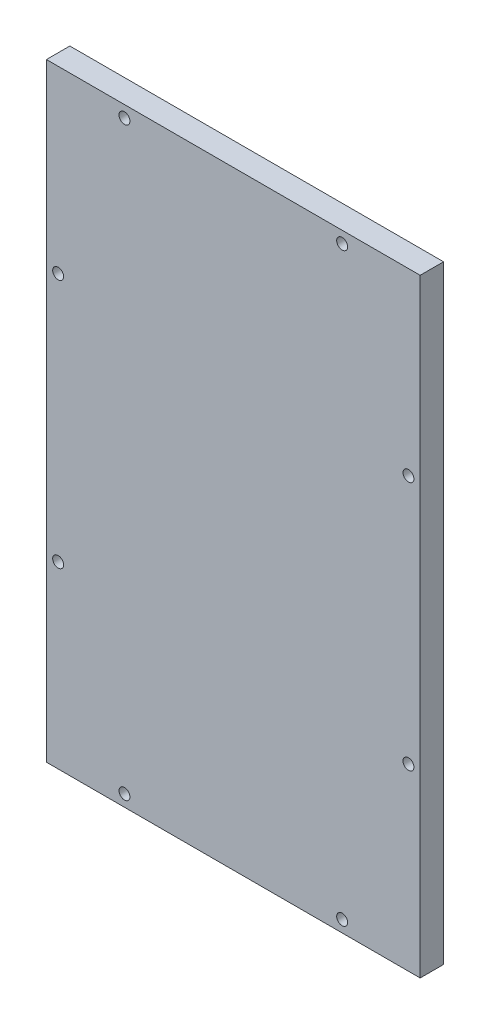
ISO-10303-21;
HEADER;
FILE_DESCRIPTION(('STEP AP214'),'2;1');
FILE_NAME('part.step','',(''),(''),'','','');
FILE_SCHEMA(('AUTOMOTIVE_DESIGN { 1 0 10303 214 1 1 1 1 }'));
ENDSEC;
DATA;
#1=APPLICATION_CONTEXT('core data for automotive mechanical design processes');
#2=APPLICATION_PROTOCOL_DEFINITION('international standard','automotive_design',2000,#1);
#3=PRODUCT_CONTEXT('',#1,'mechanical');
#4=PRODUCT('Part','Part','',(#3));
#5=PRODUCT_RELATED_PRODUCT_CATEGORY('part','',(#4));
#6=PRODUCT_DEFINITION_FORMATION('','',#4);
#7=PRODUCT_DEFINITION_CONTEXT('part definition',#1,'design');
#8=PRODUCT_DEFINITION('design','',#6,#7);
#9=PRODUCT_DEFINITION_SHAPE('','',#8);
#10=(LENGTH_UNIT() NAMED_UNIT(*) SI_UNIT(.MILLI.,.METRE.));
#11=(NAMED_UNIT(*) PLANE_ANGLE_UNIT() SI_UNIT($,.RADIAN.));
#12=(NAMED_UNIT(*) SI_UNIT($,.STERADIAN.) SOLID_ANGLE_UNIT());
#13=UNCERTAINTY_MEASURE_WITH_UNIT(LENGTH_MEASURE(1.E-05),#10,'distance_accuracy_value','');
#14=(GEOMETRIC_REPRESENTATION_CONTEXT(3) GLOBAL_UNCERTAINTY_ASSIGNED_CONTEXT((#13)) GLOBAL_UNIT_ASSIGNED_CONTEXT((#10,
#11,#12)) REPRESENTATION_CONTEXT('',''));
#15=CARTESIAN_POINT('',(0.,0.,0.));
#16=DIRECTION('',(0.,0.,1.));
#17=DIRECTION('',(1.,0.,0.));
#18=AXIS2_PLACEMENT_3D('',#15,#16,#17);
#19=CARTESIAN_POINT('',(22.45,-16.,3.));
#20=DIRECTION('',(0.,0.,-1.));
#21=DIRECTION('',(-1.,0.,0.));
#22=AXIS2_PLACEMENT_3D('',#19,#20,#21);
#23=CYLINDRICAL_SURFACE('',#22,0.699999999999998);
#24=CARTESIAN_POINT('',(22.45,-16.,3.));
#25=DIRECTION('',(0.,0.,-1.));
#26=DIRECTION('',(-1.,0.,0.));
#27=AXIS2_PLACEMENT_3D('',#24,#25,#26);
#28=CIRCLE('',#27,0.699999999999998);
#29=CARTESIAN_POINT('',(21.75,-16.,3.));
#30=VERTEX_POINT('',#29);
#31=EDGE_CURVE('E109',#30,#30,#28,.T.);
#32=ORIENTED_EDGE('',*,*,#31,.F.);
#33=EDGE_LOOP('',(#32));
#34=FACE_BOUND('',#33,.T.);
#35=CARTESIAN_POINT('',(22.45,-16.,1.5));
#36=DIRECTION('',(0.,0.,-1.));
#37=DIRECTION('',(-1.,0.,0.));
#38=AXIS2_PLACEMENT_3D('',#35,#36,#37);
#39=CIRCLE('',#38,0.699999999999998);
#40=CARTESIAN_POINT('',(21.75,-16.,1.5));
#41=VERTEX_POINT('',#40);
#42=EDGE_CURVE('E43',#41,#41,#39,.F.);
#43=ORIENTED_EDGE('',*,*,#42,.F.);
#44=EDGE_LOOP('',(#43));
#45=FACE_BOUND('',#44,.T.);
#46=ADVANCED_FACE('F39',(#34,#45),#23,.F.);
#47=CARTESIAN_POINT('',(-13.95,-37.5,3.));
#48=DIRECTION('',(0.,0.,-1.));
#49=DIRECTION('',(-1.,0.,0.));
#50=AXIS2_PLACEMENT_3D('',#47,#48,#49);
#51=CYLINDRICAL_SURFACE('',#50,0.699999999999999);
#52=CARTESIAN_POINT('',(-13.95,-37.5,3.));
#53=DIRECTION('',(0.,0.,-1.));
#54=DIRECTION('',(-1.,0.,0.));
#55=AXIS2_PLACEMENT_3D('',#52,#53,#54);
#56=CIRCLE('',#55,0.699999999999999);
#57=CARTESIAN_POINT('',(-14.65,-37.5,3.));
#58=VERTEX_POINT('',#57);
#59=EDGE_CURVE('E147',#58,#58,#56,.T.);
#60=ORIENTED_EDGE('',*,*,#59,.F.);
#61=EDGE_LOOP('',(#60));
#62=FACE_BOUND('',#61,.T.);
#63=CARTESIAN_POINT('',(-13.95,-37.5,1.5));
#64=DIRECTION('',(0.,0.,-1.));
#65=DIRECTION('',(-1.,0.,0.));
#66=AXIS2_PLACEMENT_3D('',#63,#64,#65);
#67=CIRCLE('',#66,0.699999999999999);
#68=CARTESIAN_POINT('',(-14.65,-37.5,1.5));
#69=VERTEX_POINT('',#68);
#70=EDGE_CURVE('E133',#69,#69,#67,.F.);
#71=ORIENTED_EDGE('',*,*,#70,.F.);
#72=EDGE_LOOP('',(#71));
#73=FACE_BOUND('',#72,.T.);
#74=ADVANCED_FACE('F173',(#62,#73),#51,.F.);
#75=CARTESIAN_POINT('',(-22.45,16.,3.));
#76=DIRECTION('',(0.,0.,-1.));
#77=DIRECTION('',(-1.,0.,0.));
#78=AXIS2_PLACEMENT_3D('',#75,#76,#77);
#79=CYLINDRICAL_SURFACE('',#78,0.699999999999998);
#80=CARTESIAN_POINT('',(-22.45,16.,3.));
#81=DIRECTION('',(0.,0.,-1.));
#82=DIRECTION('',(-1.,0.,0.));
#83=AXIS2_PLACEMENT_3D('',#80,#81,#82);
#84=CIRCLE('',#83,0.699999999999998);
#85=CARTESIAN_POINT('',(-23.15,16.,3.));
#86=VERTEX_POINT('',#85);
#87=EDGE_CURVE('E142',#86,#86,#84,.T.);
#88=ORIENTED_EDGE('',*,*,#87,.F.);
#89=EDGE_LOOP('',(#88));
#90=FACE_BOUND('',#89,.T.);
#91=CARTESIAN_POINT('',(-22.45,16.,1.5));
#92=DIRECTION('',(0.,0.,-1.));
#93=DIRECTION('',(-1.,0.,0.));
#94=AXIS2_PLACEMENT_3D('',#91,#92,#93);
#95=CIRCLE('',#94,0.699999999999998);
#96=CARTESIAN_POINT('',(-23.15,16.,1.5));
#97=VERTEX_POINT('',#96);
#98=EDGE_CURVE('E131',#97,#97,#95,.F.);
#99=ORIENTED_EDGE('',*,*,#98,.F.);
#100=EDGE_LOOP('',(#99));
#101=FACE_BOUND('',#100,.T.);
#102=ADVANCED_FACE('F178',(#90,#101),#79,.F.);
#103=CARTESIAN_POINT('',(-22.45,-16.,3.));
#104=DIRECTION('',(0.,0.,-1.));
#105=DIRECTION('',(-1.,0.,0.));
#106=AXIS2_PLACEMENT_3D('',#103,#104,#105);
#107=CYLINDRICAL_SURFACE('',#106,0.699999999999998);
#108=CARTESIAN_POINT('',(-22.45,-16.,3.));
#109=DIRECTION('',(0.,0.,-1.));
#110=DIRECTION('',(-1.,0.,0.));
#111=AXIS2_PLACEMENT_3D('',#108,#109,#110);
#112=CIRCLE('',#111,0.699999999999998);
#113=CARTESIAN_POINT('',(-23.15,-16.,3.));
#114=VERTEX_POINT('',#113);
#115=EDGE_CURVE('E138',#114,#114,#112,.T.);
#116=ORIENTED_EDGE('',*,*,#115,.F.);
#117=EDGE_LOOP('',(#116));
#118=FACE_BOUND('',#117,.T.);
#119=CARTESIAN_POINT('',(-22.45,-16.,1.5));
#120=DIRECTION('',(0.,0.,-1.));
#121=DIRECTION('',(-1.,0.,0.));
#122=AXIS2_PLACEMENT_3D('',#119,#120,#121);
#123=CIRCLE('',#122,0.699999999999998);
#124=CARTESIAN_POINT('',(-23.15,-16.,1.5));
#125=VERTEX_POINT('',#124);
#126=EDGE_CURVE('E128',#125,#125,#123,.F.);
#127=ORIENTED_EDGE('',*,*,#126,.F.);
#128=EDGE_LOOP('',(#127));
#129=FACE_BOUND('',#128,.T.);
#130=ADVANCED_FACE('F221',(#118,#129),#107,.F.);
#131=CARTESIAN_POINT('',(22.45,16.,3.));
#132=DIRECTION('',(0.,0.,-1.));
#133=DIRECTION('',(-1.,0.,0.));
#134=AXIS2_PLACEMENT_3D('',#131,#132,#133);
#135=CYLINDRICAL_SURFACE('',#134,0.699999999999998);
#136=CARTESIAN_POINT('',(22.45,16.,3.));
#137=DIRECTION('',(0.,0.,-1.));
#138=DIRECTION('',(-1.,0.,0.));
#139=AXIS2_PLACEMENT_3D('',#136,#137,#138);
#140=CIRCLE('',#139,0.699999999999998);
#141=CARTESIAN_POINT('',(21.75,16.,3.));
#142=VERTEX_POINT('',#141);
#143=EDGE_CURVE('E162',#142,#142,#140,.T.);
#144=ORIENTED_EDGE('',*,*,#143,.F.);
#145=EDGE_LOOP('',(#144));
#146=FACE_BOUND('',#145,.T.);
#147=CARTESIAN_POINT('',(22.45,16.,1.5));
#148=DIRECTION('',(0.,0.,-1.));
#149=DIRECTION('',(-1.,0.,0.));
#150=AXIS2_PLACEMENT_3D('',#147,#148,#149);
#151=CIRCLE('',#150,0.699999999999998);
#152=CARTESIAN_POINT('',(21.75,16.,1.5));
#153=VERTEX_POINT('',#152);
#154=EDGE_CURVE('E125',#153,#153,#151,.F.);
#155=ORIENTED_EDGE('',*,*,#154,.F.);
#156=EDGE_LOOP('',(#155));
#157=FACE_BOUND('',#156,.T.);
#158=ADVANCED_FACE('F219',(#146,#157),#135,.F.);
#159=CARTESIAN_POINT('',(13.95,37.5,3.));
#160=DIRECTION('',(0.,0.,-1.));
#161=DIRECTION('',(-1.,0.,0.));
#162=AXIS2_PLACEMENT_3D('',#159,#160,#161);
#163=CYLINDRICAL_SURFACE('',#162,0.699999999999999);
#164=CARTESIAN_POINT('',(13.95,37.5,3.));
#165=DIRECTION('',(0.,0.,-1.));
#166=DIRECTION('',(-1.,0.,0.));
#167=AXIS2_PLACEMENT_3D('',#164,#165,#166);
#168=CIRCLE('',#167,0.699999999999999);
#169=CARTESIAN_POINT('',(13.25,37.5,3.));
#170=VERTEX_POINT('',#169);
#171=EDGE_CURVE('E159',#170,#170,#168,.T.);
#172=ORIENTED_EDGE('',*,*,#171,.F.);
#173=EDGE_LOOP('',(#172));
#174=FACE_BOUND('',#173,.T.);
#175=CARTESIAN_POINT('',(13.95,37.5,1.5));
#176=DIRECTION('',(0.,0.,-1.));
#177=DIRECTION('',(-1.,0.,0.));
#178=AXIS2_PLACEMENT_3D('',#175,#176,#177);
#179=CIRCLE('',#178,0.699999999999999);
#180=CARTESIAN_POINT('',(13.25,37.5,1.5));
#181=VERTEX_POINT('',#180);
#182=EDGE_CURVE('E122',#181,#181,#179,.F.);
#183=ORIENTED_EDGE('',*,*,#182,.F.);
#184=EDGE_LOOP('',(#183));
#185=FACE_BOUND('',#184,.T.);
#186=ADVANCED_FACE('F183',(#174,#185),#163,.F.);
#187=CARTESIAN_POINT('',(-13.95,37.5,3.));
#188=DIRECTION('',(0.,0.,-1.));
#189=DIRECTION('',(-1.,0.,0.));
#190=AXIS2_PLACEMENT_3D('',#187,#188,#189);
#191=CYLINDRICAL_SURFACE('',#190,0.699999999999999);
#192=CARTESIAN_POINT('',(-13.95,37.5,3.));
#193=DIRECTION('',(0.,0.,-1.));
#194=DIRECTION('',(-1.,0.,0.));
#195=AXIS2_PLACEMENT_3D('',#192,#193,#194);
#196=CIRCLE('',#195,0.699999999999999);
#197=CARTESIAN_POINT('',(-14.65,37.5,3.));
#198=VERTEX_POINT('',#197);
#199=EDGE_CURVE('E156',#198,#198,#196,.T.);
#200=ORIENTED_EDGE('',*,*,#199,.F.);
#201=EDGE_LOOP('',(#200));
#202=FACE_BOUND('',#201,.T.);
#203=CARTESIAN_POINT('',(-13.95,37.5,1.5));
#204=DIRECTION('',(0.,0.,-1.));
#205=DIRECTION('',(-1.,0.,0.));
#206=AXIS2_PLACEMENT_3D('',#203,#204,#205);
#207=CIRCLE('',#206,0.699999999999999);
#208=CARTESIAN_POINT('',(-14.65,37.5,1.5));
#209=VERTEX_POINT('',#208);
#210=EDGE_CURVE('E118',#209,#209,#207,.F.);
#211=ORIENTED_EDGE('',*,*,#210,.F.);
#212=EDGE_LOOP('',(#211));
#213=FACE_BOUND('',#212,.T.);
#214=ADVANCED_FACE('F206',(#202,#213),#191,.F.);
#215=CARTESIAN_POINT('',(13.95,-37.5,3.));
#216=DIRECTION('',(0.,0.,-1.));
#217=DIRECTION('',(-1.,0.,0.));
#218=AXIS2_PLACEMENT_3D('',#215,#216,#217);
#219=CYLINDRICAL_SURFACE('',#218,0.699999999999999);
#220=CARTESIAN_POINT('',(13.95,-37.5,3.));
#221=DIRECTION('',(0.,0.,-1.));
#222=DIRECTION('',(-1.,0.,0.));
#223=AXIS2_PLACEMENT_3D('',#220,#221,#222);
#224=CIRCLE('',#223,0.699999999999999);
#225=CARTESIAN_POINT('',(13.25,-37.5,3.));
#226=VERTEX_POINT('',#225);
#227=EDGE_CURVE('E154',#226,#226,#224,.T.);
#228=ORIENTED_EDGE('',*,*,#227,.F.);
#229=EDGE_LOOP('',(#228));
#230=FACE_BOUND('',#229,.T.);
#231=CARTESIAN_POINT('',(13.95,-37.5,1.5));
#232=DIRECTION('',(0.,0.,-1.));
#233=DIRECTION('',(-1.,0.,0.));
#234=AXIS2_PLACEMENT_3D('',#231,#232,#233);
#235=CIRCLE('',#234,0.699999999999999);
#236=CARTESIAN_POINT('',(13.25,-37.5,1.5));
#237=VERTEX_POINT('',#236);
#238=EDGE_CURVE('E115',#237,#237,#235,.F.);
#239=ORIENTED_EDGE('',*,*,#238,.F.);
#240=EDGE_LOOP('',(#239));
#241=FACE_BOUND('',#240,.T.);
#242=ADVANCED_FACE('F201',(#230,#241),#219,.F.);
#243=CARTESIAN_POINT('',(-23.95,39.,3.));
#244=DIRECTION('',(1.,0.,0.));
#245=DIRECTION('',(0.,0.,-1.));
#246=AXIS2_PLACEMENT_3D('',#243,#244,#245);
#247=PLANE('',#246);
#248=DIRECTION('',(0.,-1.,0.));
#249=VECTOR('',#248,1.);
#250=CARTESIAN_POINT('',(-23.95,39.,0.));
#251=LINE('',#250,#249);
#252=CARTESIAN_POINT('',(-23.95,39.,0.));
#253=VERTEX_POINT('',#252);
#254=CARTESIAN_POINT('',(-23.95,-39.,0.));
#255=VERTEX_POINT('',#254);
#256=EDGE_CURVE('E106',#253,#255,#251,.T.);
#257=ORIENTED_EDGE('',*,*,#256,.T.);
#258=DIRECTION('',(0.,0.,-1.));
#259=VECTOR('',#258,1.);
#260=CARTESIAN_POINT('',(-23.95,-39.,3.));
#261=LINE('',#260,#259);
#262=CARTESIAN_POINT('',(-23.95,-39.,3.));
#263=VERTEX_POINT('',#262);
#264=EDGE_CURVE('E11',#263,#255,#261,.T.);
#265=ORIENTED_EDGE('',*,*,#264,.F.);
#266=DIRECTION('',(0.,-1.,0.));
#267=VECTOR('',#266,1.);
#268=CARTESIAN_POINT('',(-23.95,39.,3.));
#269=LINE('',#268,#267);
#270=CARTESIAN_POINT('',(-23.95,39.,3.));
#271=VERTEX_POINT('',#270);
#272=EDGE_CURVE('E93',#271,#263,#269,.T.);
#273=ORIENTED_EDGE('',*,*,#272,.F.);
#274=DIRECTION('',(0.,0.,-1.));
#275=VECTOR('',#274,1.);
#276=CARTESIAN_POINT('',(-23.95,39.,3.));
#277=LINE('',#276,#275);
#278=EDGE_CURVE('E102',#271,#253,#277,.T.);
#279=ORIENTED_EDGE('',*,*,#278,.T.);
#280=EDGE_LOOP('',(#257,#265,#273,#279));
#281=FACE_BOUND('',#280,.T.);
#282=ADVANCED_FACE('F41',(#281),#247,.F.);
#283=CARTESIAN_POINT('',(-23.95,-39.,3.));
#284=DIRECTION('',(0.,1.,0.));
#285=DIRECTION('',(0.,0.,1.));
#286=AXIS2_PLACEMENT_3D('',#283,#284,#285);
#287=PLANE('',#286);
#288=DIRECTION('',(1.,0.,0.));
#289=VECTOR('',#288,1.);
#290=CARTESIAN_POINT('',(-23.95,-39.,0.));
#291=LINE('',#290,#289);
#292=CARTESIAN_POINT('',(23.95,-39.,0.));
#293=VERTEX_POINT('',#292);
#294=EDGE_CURVE('E97',#255,#293,#291,.T.);
#295=ORIENTED_EDGE('',*,*,#294,.T.);
#296=DIRECTION('',(0.,0.,-1.));
#297=VECTOR('',#296,1.);
#298=CARTESIAN_POINT('',(23.95,-39.,3.));
#299=LINE('',#298,#297);
#300=CARTESIAN_POINT('',(23.95,-39.,3.));
#301=VERTEX_POINT('',#300);
#302=EDGE_CURVE('E49',#301,#293,#299,.T.);
#303=ORIENTED_EDGE('',*,*,#302,.F.);
#304=DIRECTION('',(1.,0.,0.));
#305=VECTOR('',#304,1.);
#306=CARTESIAN_POINT('',(-23.95,-39.,3.));
#307=LINE('',#306,#305);
#308=EDGE_CURVE('E88',#263,#301,#307,.T.);
#309=ORIENTED_EDGE('',*,*,#308,.F.);
#310=ORIENTED_EDGE('',*,*,#264,.T.);
#311=EDGE_LOOP('',(#295,#303,#309,#310));
#312=FACE_BOUND('',#311,.T.);
#313=ADVANCED_FACE('F96',(#312),#287,.F.);
#314=CARTESIAN_POINT('',(23.95,39.,3.));
#315=DIRECTION('',(-1.,0.,0.));
#316=DIRECTION('',(0.,0.,1.));
#317=AXIS2_PLACEMENT_3D('',#314,#315,#316);
#318=PLANE('',#317);
#319=DIRECTION('',(0.,1.,0.));
#320=VECTOR('',#319,1.);
#321=CARTESIAN_POINT('',(23.95,39.,0.));
#322=LINE('',#321,#320);
#323=CARTESIAN_POINT('',(23.95,39.,0.));
#324=VERTEX_POINT('',#323);
#325=EDGE_CURVE('E75',#293,#324,#322,.T.);
#326=ORIENTED_EDGE('',*,*,#325,.T.);
#327=DIRECTION('',(0.,0.,-1.));
#328=VECTOR('',#327,1.);
#329=CARTESIAN_POINT('',(23.95,39.,3.));
#330=LINE('',#329,#328);
#331=CARTESIAN_POINT('',(23.95,39.,3.));
#332=VERTEX_POINT('',#331);
#333=EDGE_CURVE('E98',#332,#324,#330,.T.);
#334=ORIENTED_EDGE('',*,*,#333,.F.);
#335=DIRECTION('',(0.,1.,0.));
#336=VECTOR('',#335,1.);
#337=CARTESIAN_POINT('',(23.95,39.,3.));
#338=LINE('',#337,#336);
#339=EDGE_CURVE('E91',#301,#332,#338,.T.);
#340=ORIENTED_EDGE('',*,*,#339,.F.);
#341=ORIENTED_EDGE('',*,*,#302,.T.);
#342=EDGE_LOOP('',(#326,#334,#340,#341));
#343=FACE_BOUND('',#342,.T.);
#344=ADVANCED_FACE('F100',(#343),#318,.F.);
#345=CARTESIAN_POINT('',(-23.95,39.,3.));
#346=DIRECTION('',(0.,-1.,0.));
#347=DIRECTION('',(0.,0.,-1.));
#348=AXIS2_PLACEMENT_3D('',#345,#346,#347);
#349=PLANE('',#348);
#350=DIRECTION('',(-1.,0.,0.));
#351=VECTOR('',#350,1.);
#352=CARTESIAN_POINT('',(-23.95,39.,0.));
#353=LINE('',#352,#351);
#354=EDGE_CURVE('E81',#324,#253,#353,.T.);
#355=ORIENTED_EDGE('',*,*,#354,.T.);
#356=ORIENTED_EDGE('',*,*,#278,.F.);
#357=DIRECTION('',(-1.,0.,0.));
#358=VECTOR('',#357,1.);
#359=CARTESIAN_POINT('',(-23.95,39.,3.));
#360=LINE('',#359,#358);
#361=EDGE_CURVE('E58',#332,#271,#360,.T.);
#362=ORIENTED_EDGE('',*,*,#361,.F.);
#363=ORIENTED_EDGE('',*,*,#333,.T.);
#364=EDGE_LOOP('',(#355,#356,#362,#363));
#365=FACE_BOUND('',#364,.T.);
#366=ADVANCED_FACE('F188',(#365),#349,.F.);
#367=CARTESIAN_POINT('',(0.,0.,3.));
#368=DIRECTION('',(0.,0.,1.));
#369=DIRECTION('',(1.,0.,0.));
#370=AXIS2_PLACEMENT_3D('',#367,#368,#369);
#371=PLANE('',#370);
#372=ORIENTED_EDGE('',*,*,#227,.T.);
#373=EDGE_LOOP('',(#372));
#374=FACE_BOUND('',#373,.T.);
#375=ORIENTED_EDGE('',*,*,#199,.T.);
#376=EDGE_LOOP('',(#375));
#377=FACE_BOUND('',#376,.T.);
#378=ORIENTED_EDGE('',*,*,#171,.T.);
#379=EDGE_LOOP('',(#378));
#380=FACE_BOUND('',#379,.T.);
#381=ORIENTED_EDGE('',*,*,#143,.T.);
#382=EDGE_LOOP('',(#381));
#383=FACE_BOUND('',#382,.T.);
#384=ORIENTED_EDGE('',*,*,#115,.T.);
#385=EDGE_LOOP('',(#384));
#386=FACE_BOUND('',#385,.T.);
#387=ORIENTED_EDGE('',*,*,#87,.T.);
#388=EDGE_LOOP('',(#387));
#389=FACE_BOUND('',#388,.T.);
#390=ORIENTED_EDGE('',*,*,#59,.T.);
#391=EDGE_LOOP('',(#390));
#392=FACE_BOUND('',#391,.T.);
#393=ORIENTED_EDGE('',*,*,#31,.T.);
#394=EDGE_LOOP('',(#393));
#395=FACE_BOUND('',#394,.T.);
#396=ORIENTED_EDGE('',*,*,#272,.T.);
#397=ORIENTED_EDGE('',*,*,#308,.T.);
#398=ORIENTED_EDGE('',*,*,#339,.T.);
#399=ORIENTED_EDGE('',*,*,#361,.T.);
#400=EDGE_LOOP('',(#396,#397,#398,#399));
#401=FACE_BOUND('',#400,.T.);
#402=ADVANCED_FACE('F89',(#374,#377,#380,#383,#386,#389,#392,#395,#401),#371,.T.);
#403=CARTESIAN_POINT('',(0.,0.,0.));
#404=DIRECTION('',(0.,0.,1.));
#405=DIRECTION('',(1.,0.,0.));
#406=AXIS2_PLACEMENT_3D('',#403,#404,#405);
#407=PLANE('',#406);
#408=CARTESIAN_POINT('',(13.95,37.5,0.));
#409=DIRECTION('',(0.,0.,-1.));
#410=DIRECTION('',(-1.,0.,0.));
#411=AXIS2_PLACEMENT_3D('',#408,#409,#410);
#412=CIRCLE('',#411,1.);
#413=CARTESIAN_POINT('',(12.95,37.5,0.));
#414=VERTEX_POINT('',#413);
#415=EDGE_CURVE('E338',#414,#414,#412,.T.);
#416=ORIENTED_EDGE('',*,*,#415,.F.);
#417=EDGE_LOOP('',(#416));
#418=FACE_BOUND('',#417,.T.);
#419=CARTESIAN_POINT('',(-13.95,37.5,0.));
#420=DIRECTION('',(0.,0.,-1.));
#421=DIRECTION('',(-1.,0.,0.));
#422=AXIS2_PLACEMENT_3D('',#419,#420,#421);
#423=CIRCLE('',#422,1.);
#424=CARTESIAN_POINT('',(-14.95,37.5,0.));
#425=VERTEX_POINT('',#424);
#426=EDGE_CURVE('E344',#425,#425,#423,.T.);
#427=ORIENTED_EDGE('',*,*,#426,.F.);
#428=EDGE_LOOP('',(#427));
#429=FACE_BOUND('',#428,.T.);
#430=CARTESIAN_POINT('',(-22.45,16.,0.));
#431=DIRECTION('',(0.,0.,-1.));
#432=DIRECTION('',(-1.,0.,0.));
#433=AXIS2_PLACEMENT_3D('',#430,#431,#432);
#434=CIRCLE('',#433,1.);
#435=CARTESIAN_POINT('',(-23.45,16.,0.));
#436=VERTEX_POINT('',#435);
#437=EDGE_CURVE('E350',#436,#436,#434,.T.);
#438=ORIENTED_EDGE('',*,*,#437,.F.);
#439=EDGE_LOOP('',(#438));
#440=FACE_BOUND('',#439,.T.);
#441=CARTESIAN_POINT('',(-22.45,-16.,0.));
#442=DIRECTION('',(0.,0.,-1.));
#443=DIRECTION('',(-1.,0.,0.));
#444=AXIS2_PLACEMENT_3D('',#441,#442,#443);
#445=CIRCLE('',#444,1.);
#446=CARTESIAN_POINT('',(-23.45,-16.,0.));
#447=VERTEX_POINT('',#446);
#448=EDGE_CURVE('E322',#447,#447,#445,.T.);
#449=ORIENTED_EDGE('',*,*,#448,.F.);
#450=EDGE_LOOP('',(#449));
#451=FACE_BOUND('',#450,.T.);
#452=CARTESIAN_POINT('',(-13.95,-37.5,0.));
#453=DIRECTION('',(0.,0.,-1.));
#454=DIRECTION('',(-1.,0.,0.));
#455=AXIS2_PLACEMENT_3D('',#452,#453,#454);
#456=CIRCLE('',#455,1.);
#457=CARTESIAN_POINT('',(-14.95,-37.5,0.));
#458=VERTEX_POINT('',#457);
#459=EDGE_CURVE('E317',#458,#458,#456,.T.);
#460=ORIENTED_EDGE('',*,*,#459,.F.);
#461=EDGE_LOOP('',(#460));
#462=FACE_BOUND('',#461,.T.);
#463=CARTESIAN_POINT('',(13.95,-37.5,0.));
#464=DIRECTION('',(0.,0.,-1.));
#465=DIRECTION('',(-1.,0.,0.));
#466=AXIS2_PLACEMENT_3D('',#463,#464,#465);
#467=CIRCLE('',#466,1.);
#468=CARTESIAN_POINT('',(12.95,-37.5,0.));
#469=VERTEX_POINT('',#468);
#470=EDGE_CURVE('E324',#469,#469,#467,.T.);
#471=ORIENTED_EDGE('',*,*,#470,.F.);
#472=EDGE_LOOP('',(#471));
#473=FACE_BOUND('',#472,.T.);
#474=CARTESIAN_POINT('',(22.45,-16.,0.));
#475=DIRECTION('',(0.,0.,-1.));
#476=DIRECTION('',(-1.,0.,0.));
#477=AXIS2_PLACEMENT_3D('',#474,#475,#476);
#478=CIRCLE('',#477,1.);
#479=CARTESIAN_POINT('',(21.45,-16.,0.));
#480=VERTEX_POINT('',#479);
#481=EDGE_CURVE('E332',#480,#480,#478,.T.);
#482=ORIENTED_EDGE('',*,*,#481,.F.);
#483=EDGE_LOOP('',(#482));
#484=FACE_BOUND('',#483,.T.);
#485=CARTESIAN_POINT('',(22.45,16.,0.));
#486=DIRECTION('',(0.,0.,-1.));
#487=DIRECTION('',(-1.,0.,0.));
#488=AXIS2_PLACEMENT_3D('',#485,#486,#487);
#489=CIRCLE('',#488,1.);
#490=CARTESIAN_POINT('',(21.45,16.,0.));
#491=VERTEX_POINT('',#490);
#492=EDGE_CURVE('E151',#491,#491,#489,.T.);
#493=ORIENTED_EDGE('',*,*,#492,.F.);
#494=EDGE_LOOP('',(#493));
#495=FACE_BOUND('',#494,.T.);
#496=ORIENTED_EDGE('',*,*,#256,.F.);
#497=ORIENTED_EDGE('',*,*,#354,.F.);
#498=ORIENTED_EDGE('',*,*,#325,.F.);
#499=ORIENTED_EDGE('',*,*,#294,.F.);
#500=EDGE_LOOP('',(#496,#497,#498,#499));
#501=FACE_BOUND('',#500,.T.);
#502=ADVANCED_FACE('F187',(#418,#429,#440,#451,#462,#473,#484,#495,#501),#407,.F.);
#503=CARTESIAN_POINT('',(13.95,-37.5,1.5));
#504=DIRECTION('',(0.,0.,-1.));
#505=DIRECTION('',(-1.,0.,0.));
#506=AXIS2_PLACEMENT_3D('',#503,#504,#505);
#507=PLANE('',#506);
#508=CARTESIAN_POINT('',(13.95,-37.5,1.5));
#509=DIRECTION('',(0.,0.,-1.));
#510=DIRECTION('',(-1.,0.,0.));
#511=AXIS2_PLACEMENT_3D('',#508,#509,#510);
#512=CIRCLE('',#511,1.);
#513=CARTESIAN_POINT('',(12.95,-37.5,1.5));
#514=VERTEX_POINT('',#513);
#515=EDGE_CURVE('E329',#514,#514,#512,.T.);
#516=ORIENTED_EDGE('',*,*,#515,.T.);
#517=EDGE_LOOP('',(#516));
#518=FACE_BOUND('',#517,.T.);
#519=ORIENTED_EDGE('',*,*,#238,.T.);
#520=EDGE_LOOP('',(#519));
#521=FACE_BOUND('',#520,.T.);
#522=ADVANCED_FACE('F192',(#518,#521),#507,.T.);
#523=CARTESIAN_POINT('',(13.95,-37.5,1.5));
#524=DIRECTION('',(0.,0.,-1.));
#525=DIRECTION('',(-1.,0.,0.));
#526=AXIS2_PLACEMENT_3D('',#523,#524,#525);
#527=CYLINDRICAL_SURFACE('',#526,1.);
#528=ORIENTED_EDGE('',*,*,#515,.F.);
#529=EDGE_LOOP('',(#528));
#530=FACE_BOUND('',#529,.T.);
#531=ORIENTED_EDGE('',*,*,#470,.T.);
#532=EDGE_LOOP('',(#531));
#533=FACE_BOUND('',#532,.T.);
#534=ADVANCED_FACE('F281',(#530,#533),#527,.F.);
#535=CARTESIAN_POINT('',(-13.95,37.5,1.5));
#536=DIRECTION('',(0.,0.,-1.));
#537=DIRECTION('',(-1.,0.,0.));
#538=AXIS2_PLACEMENT_3D('',#535,#536,#537);
#539=PLANE('',#538);
#540=CARTESIAN_POINT('',(-13.95,37.5,1.5));
#541=DIRECTION('',(0.,0.,-1.));
#542=DIRECTION('',(-1.,0.,0.));
#543=AXIS2_PLACEMENT_3D('',#540,#541,#542);
#544=CIRCLE('',#543,1.);
#545=CARTESIAN_POINT('',(-14.95,37.5,1.5));
#546=VERTEX_POINT('',#545);
#547=EDGE_CURVE('E347',#546,#546,#544,.T.);
#548=ORIENTED_EDGE('',*,*,#547,.T.);
#549=EDGE_LOOP('',(#548));
#550=FACE_BOUND('',#549,.T.);
#551=ORIENTED_EDGE('',*,*,#210,.T.);
#552=EDGE_LOOP('',(#551));
#553=FACE_BOUND('',#552,.T.);
#554=ADVANCED_FACE('F277',(#550,#553),#539,.T.);
#555=CARTESIAN_POINT('',(-13.95,37.5,1.5));
#556=DIRECTION('',(0.,0.,-1.));
#557=DIRECTION('',(-1.,0.,0.));
#558=AXIS2_PLACEMENT_3D('',#555,#556,#557);
#559=CYLINDRICAL_SURFACE('',#558,1.);
#560=ORIENTED_EDGE('',*,*,#547,.F.);
#561=EDGE_LOOP('',(#560));
#562=FACE_BOUND('',#561,.T.);
#563=ORIENTED_EDGE('',*,*,#426,.T.);
#564=EDGE_LOOP('',(#563));
#565=FACE_BOUND('',#564,.T.);
#566=ADVANCED_FACE('F280',(#562,#565),#559,.F.);
#567=CARTESIAN_POINT('',(13.95,37.5,1.5));
#568=DIRECTION('',(0.,0.,-1.));
#569=DIRECTION('',(-1.,0.,0.));
#570=AXIS2_PLACEMENT_3D('',#567,#568,#569);
#571=PLANE('',#570);
#572=CARTESIAN_POINT('',(13.95,37.5,1.5));
#573=DIRECTION('',(0.,0.,-1.));
#574=DIRECTION('',(-1.,0.,0.));
#575=AXIS2_PLACEMENT_3D('',#572,#573,#574);
#576=CIRCLE('',#575,1.);
#577=CARTESIAN_POINT('',(12.95,37.5,1.5));
#578=VERTEX_POINT('',#577);
#579=EDGE_CURVE('E341',#578,#578,#576,.T.);
#580=ORIENTED_EDGE('',*,*,#579,.T.);
#581=EDGE_LOOP('',(#580));
#582=FACE_BOUND('',#581,.T.);
#583=ORIENTED_EDGE('',*,*,#182,.T.);
#584=EDGE_LOOP('',(#583));
#585=FACE_BOUND('',#584,.T.);
#586=ADVANCED_FACE('F247',(#582,#585),#571,.T.);
#587=CARTESIAN_POINT('',(13.95,37.5,1.5));
#588=DIRECTION('',(0.,0.,-1.));
#589=DIRECTION('',(-1.,0.,0.));
#590=AXIS2_PLACEMENT_3D('',#587,#588,#589);
#591=CYLINDRICAL_SURFACE('',#590,1.);
#592=ORIENTED_EDGE('',*,*,#579,.F.);
#593=EDGE_LOOP('',(#592));
#594=FACE_BOUND('',#593,.T.);
#595=ORIENTED_EDGE('',*,*,#415,.T.);
#596=EDGE_LOOP('',(#595));
#597=FACE_BOUND('',#596,.T.);
#598=ADVANCED_FACE('F237',(#594,#597),#591,.F.);
#599=CARTESIAN_POINT('',(22.45,16.,1.5));
#600=DIRECTION('',(0.,0.,-1.));
#601=DIRECTION('',(-1.,0.,0.));
#602=AXIS2_PLACEMENT_3D('',#599,#600,#601);
#603=PLANE('',#602);
#604=CARTESIAN_POINT('',(22.45,16.,1.5));
#605=DIRECTION('',(0.,0.,-1.));
#606=DIRECTION('',(-1.,0.,0.));
#607=AXIS2_PLACEMENT_3D('',#604,#605,#606);
#608=CIRCLE('',#607,1.);
#609=CARTESIAN_POINT('',(21.45,16.,1.5));
#610=VERTEX_POINT('',#609);
#611=EDGE_CURVE('E119',#610,#610,#608,.T.);
#612=ORIENTED_EDGE('',*,*,#611,.T.);
#613=EDGE_LOOP('',(#612));
#614=FACE_BOUND('',#613,.T.);
#615=ORIENTED_EDGE('',*,*,#154,.T.);
#616=EDGE_LOOP('',(#615));
#617=FACE_BOUND('',#616,.T.);
#618=ADVANCED_FACE('F234',(#614,#617),#603,.T.);
#619=CARTESIAN_POINT('',(22.45,16.,1.5));
#620=DIRECTION('',(0.,0.,-1.));
#621=DIRECTION('',(-1.,0.,0.));
#622=AXIS2_PLACEMENT_3D('',#619,#620,#621);
#623=CYLINDRICAL_SURFACE('',#622,1.);
#624=ORIENTED_EDGE('',*,*,#611,.F.);
#625=EDGE_LOOP('',(#624));
#626=FACE_BOUND('',#625,.T.);
#627=ORIENTED_EDGE('',*,*,#492,.T.);
#628=EDGE_LOOP('',(#627));
#629=FACE_BOUND('',#628,.T.);
#630=ADVANCED_FACE('F236',(#626,#629),#623,.F.);
#631=CARTESIAN_POINT('',(-22.45,-16.,1.5));
#632=DIRECTION('',(0.,0.,-1.));
#633=DIRECTION('',(-1.,0.,0.));
#634=AXIS2_PLACEMENT_3D('',#631,#632,#633);
#635=PLANE('',#634);
#636=CARTESIAN_POINT('',(-22.45,-16.,1.5));
#637=DIRECTION('',(0.,0.,-1.));
#638=DIRECTION('',(-1.,0.,0.));
#639=AXIS2_PLACEMENT_3D('',#636,#637,#638);
#640=CIRCLE('',#639,1.);
#641=CARTESIAN_POINT('',(-23.45,-16.,1.5));
#642=VERTEX_POINT('',#641);
#643=EDGE_CURVE('E319',#642,#642,#640,.T.);
#644=ORIENTED_EDGE('',*,*,#643,.T.);
#645=EDGE_LOOP('',(#644));
#646=FACE_BOUND('',#645,.T.);
#647=ORIENTED_EDGE('',*,*,#126,.T.);
#648=EDGE_LOOP('',(#647));
#649=FACE_BOUND('',#648,.T.);
#650=ADVANCED_FACE('F244',(#646,#649),#635,.T.);
#651=CARTESIAN_POINT('',(-22.45,-16.,1.5));
#652=DIRECTION('',(0.,0.,-1.));
#653=DIRECTION('',(-1.,0.,0.));
#654=AXIS2_PLACEMENT_3D('',#651,#652,#653);
#655=CYLINDRICAL_SURFACE('',#654,1.);
#656=ORIENTED_EDGE('',*,*,#643,.F.);
#657=EDGE_LOOP('',(#656));
#658=FACE_BOUND('',#657,.T.);
#659=ORIENTED_EDGE('',*,*,#448,.T.);
#660=EDGE_LOOP('',(#659));
#661=FACE_BOUND('',#660,.T.);
#662=ADVANCED_FACE('F264',(#658,#661),#655,.F.);
#663=CARTESIAN_POINT('',(-22.45,16.,1.5));
#664=DIRECTION('',(0.,0.,-1.));
#665=DIRECTION('',(-1.,0.,0.));
#666=AXIS2_PLACEMENT_3D('',#663,#664,#665);
#667=PLANE('',#666);
#668=CARTESIAN_POINT('',(-22.45,16.,1.5));
#669=DIRECTION('',(0.,0.,-1.));
#670=DIRECTION('',(-1.,0.,0.));
#671=AXIS2_PLACEMENT_3D('',#668,#669,#670);
#672=CIRCLE('',#671,1.);
#673=CARTESIAN_POINT('',(-23.45,16.,1.5));
#674=VERTEX_POINT('',#673);
#675=EDGE_CURVE('E353',#674,#674,#672,.T.);
#676=ORIENTED_EDGE('',*,*,#675,.T.);
#677=EDGE_LOOP('',(#676));
#678=FACE_BOUND('',#677,.T.);
#679=ORIENTED_EDGE('',*,*,#98,.T.);
#680=EDGE_LOOP('',(#679));
#681=FACE_BOUND('',#680,.T.);
#682=ADVANCED_FACE('F261',(#678,#681),#667,.T.);
#683=CARTESIAN_POINT('',(-22.45,16.,1.5));
#684=DIRECTION('',(0.,0.,-1.));
#685=DIRECTION('',(-1.,0.,0.));
#686=AXIS2_PLACEMENT_3D('',#683,#684,#685);
#687=CYLINDRICAL_SURFACE('',#686,1.);
#688=ORIENTED_EDGE('',*,*,#675,.F.);
#689=EDGE_LOOP('',(#688));
#690=FACE_BOUND('',#689,.T.);
#691=ORIENTED_EDGE('',*,*,#437,.T.);
#692=EDGE_LOOP('',(#691));
#693=FACE_BOUND('',#692,.T.);
#694=ADVANCED_FACE('F263',(#690,#693),#687,.F.);
#695=CARTESIAN_POINT('',(-13.95,-37.5,1.5));
#696=DIRECTION('',(0.,0.,-1.));
#697=DIRECTION('',(-1.,0.,0.));
#698=AXIS2_PLACEMENT_3D('',#695,#696,#697);
#699=PLANE('',#698);
#700=CARTESIAN_POINT('',(-13.95,-37.5,1.5));
#701=DIRECTION('',(0.,0.,-1.));
#702=DIRECTION('',(-1.,0.,0.));
#703=AXIS2_PLACEMENT_3D('',#700,#701,#702);
#704=CIRCLE('',#703,1.);
#705=CARTESIAN_POINT('',(-14.95,-37.5,1.5));
#706=VERTEX_POINT('',#705);
#707=EDGE_CURVE('E314',#706,#706,#704,.T.);
#708=ORIENTED_EDGE('',*,*,#707,.T.);
#709=EDGE_LOOP('',(#708));
#710=FACE_BOUND('',#709,.T.);
#711=ORIENTED_EDGE('',*,*,#70,.T.);
#712=EDGE_LOOP('',(#711));
#713=FACE_BOUND('',#712,.T.);
#714=ADVANCED_FACE('F271',(#710,#713),#699,.T.);
#715=CARTESIAN_POINT('',(-13.95,-37.5,1.5));
#716=DIRECTION('',(0.,0.,-1.));
#717=DIRECTION('',(-1.,0.,0.));
#718=AXIS2_PLACEMENT_3D('',#715,#716,#717);
#719=CYLINDRICAL_SURFACE('',#718,1.);
#720=ORIENTED_EDGE('',*,*,#707,.F.);
#721=EDGE_LOOP('',(#720));
#722=FACE_BOUND('',#721,.T.);
#723=ORIENTED_EDGE('',*,*,#459,.T.);
#724=EDGE_LOOP('',(#723));
#725=FACE_BOUND('',#724,.T.);
#726=ADVANCED_FACE('F293',(#722,#725),#719,.F.);
#727=CARTESIAN_POINT('',(22.45,-16.,1.5));
#728=DIRECTION('',(0.,0.,-1.));
#729=DIRECTION('',(-1.,0.,0.));
#730=AXIS2_PLACEMENT_3D('',#727,#728,#729);
#731=PLANE('',#730);
#732=CARTESIAN_POINT('',(22.45,-16.,1.5));
#733=DIRECTION('',(0.,0.,-1.));
#734=DIRECTION('',(-1.,0.,0.));
#735=AXIS2_PLACEMENT_3D('',#732,#733,#734);
#736=CIRCLE('',#735,1.);
#737=CARTESIAN_POINT('',(21.45,-16.,1.5));
#738=VERTEX_POINT('',#737);
#739=EDGE_CURVE('E335',#738,#738,#736,.T.);
#740=ORIENTED_EDGE('',*,*,#739,.T.);
#741=EDGE_LOOP('',(#740));
#742=FACE_BOUND('',#741,.T.);
#743=ORIENTED_EDGE('',*,*,#42,.T.);
#744=EDGE_LOOP('',(#743));
#745=FACE_BOUND('',#744,.T.);
#746=ADVANCED_FACE('F289',(#742,#745),#731,.T.);
#747=CARTESIAN_POINT('',(22.45,-16.,1.5));
#748=DIRECTION('',(0.,0.,-1.));
#749=DIRECTION('',(-1.,0.,0.));
#750=AXIS2_PLACEMENT_3D('',#747,#748,#749);
#751=CYLINDRICAL_SURFACE('',#750,1.);
#752=ORIENTED_EDGE('',*,*,#739,.F.);
#753=EDGE_LOOP('',(#752));
#754=FACE_BOUND('',#753,.T.);
#755=ORIENTED_EDGE('',*,*,#481,.T.);
#756=EDGE_LOOP('',(#755));
#757=FACE_BOUND('',#756,.T.);
#758=ADVANCED_FACE('F292',(#754,#757),#751,.F.);
#759=CLOSED_SHELL('',(#46,#74,#102,#130,#158,#186,#214,#242,#282,#313,#344,#366,#402,#502,#522,
#534,#554,#566,#586,#598,#618,#630,#650,#662,#682,#694,#714,#726,#746,#758));
#760=MANIFOLD_SOLID_BREP('B2',#759);
#761=ADVANCED_BREP_SHAPE_REPRESENTATION('',(#18,#760),#14);
#762=SHAPE_DEFINITION_REPRESENTATION(#9,#761);
ENDSEC;
END-ISO-10303-21;
